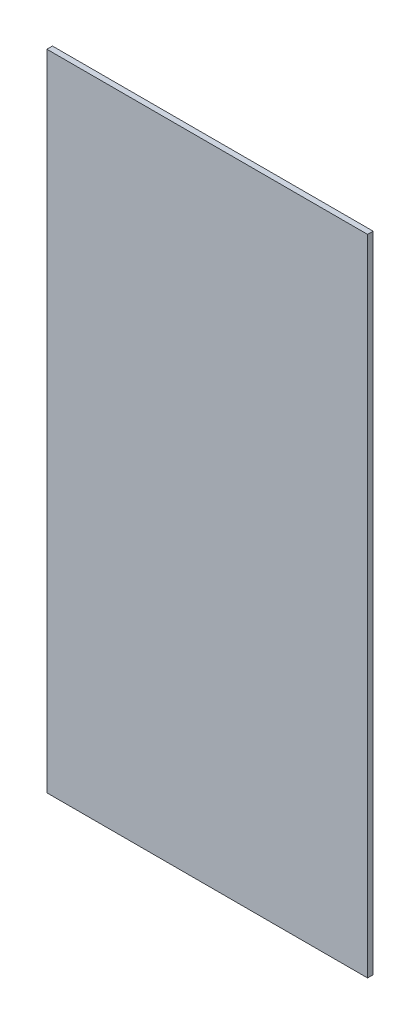
ISO-10303-21;
HEADER;
FILE_DESCRIPTION(('STEP AP214'),'2;1');
FILE_NAME('part.step','',(''),(''),'','','');
FILE_SCHEMA(('AUTOMOTIVE_DESIGN { 1 0 10303 214 1 1 1 1 }'));
ENDSEC;
DATA;
#1=APPLICATION_CONTEXT('core data for automotive mechanical design processes');
#2=APPLICATION_PROTOCOL_DEFINITION('international standard','automotive_design',2000,#1);
#3=PRODUCT_CONTEXT('',#1,'mechanical');
#4=PRODUCT('Part','Part','',(#3));
#5=PRODUCT_RELATED_PRODUCT_CATEGORY('part','',(#4));
#6=PRODUCT_DEFINITION_FORMATION('','',#4);
#7=PRODUCT_DEFINITION_CONTEXT('part definition',#1,'design');
#8=PRODUCT_DEFINITION('design','',#6,#7);
#9=PRODUCT_DEFINITION_SHAPE('','',#8);
#10=(LENGTH_UNIT() NAMED_UNIT(*) SI_UNIT(.MILLI.,.METRE.));
#11=(NAMED_UNIT(*) PLANE_ANGLE_UNIT() SI_UNIT($,.RADIAN.));
#12=(NAMED_UNIT(*) SI_UNIT($,.STERADIAN.) SOLID_ANGLE_UNIT());
#13=UNCERTAINTY_MEASURE_WITH_UNIT(LENGTH_MEASURE(1.E-05),#10,'distance_accuracy_value','');
#14=(GEOMETRIC_REPRESENTATION_CONTEXT(3) GLOBAL_UNCERTAINTY_ASSIGNED_CONTEXT((#13)) GLOBAL_UNIT_ASSIGNED_CONTEXT((#10,
#11,#12)) REPRESENTATION_CONTEXT('',''));
#15=CARTESIAN_POINT('',(0.,0.,0.));
#16=DIRECTION('',(0.,0.,1.));
#17=DIRECTION('',(1.,0.,0.));
#18=AXIS2_PLACEMENT_3D('',#15,#16,#17);
#19=CARTESIAN_POINT('',(187.5,-376.5,6.5));
#20=DIRECTION('',(-1.,0.,0.));
#21=DIRECTION('',(0.,0.,1.));
#22=AXIS2_PLACEMENT_3D('',#19,#20,#21);
#23=PLANE('',#22);
#24=DIRECTION('',(0.,1.,0.));
#25=VECTOR('',#24,1.);
#26=CARTESIAN_POINT('',(187.5,-376.5,0.));
#27=LINE('',#26,#25);
#28=CARTESIAN_POINT('',(187.5,-376.5,0.));
#29=VERTEX_POINT('',#28);
#30=CARTESIAN_POINT('',(187.5,376.5,0.));
#31=VERTEX_POINT('',#30);
#32=EDGE_CURVE('E95',#29,#31,#27,.T.);
#33=ORIENTED_EDGE('',*,*,#32,.T.);
#34=DIRECTION('',(0.,0.,-1.));
#35=VECTOR('',#34,1.);
#36=CARTESIAN_POINT('',(187.5,376.5,6.5));
#37=LINE('',#36,#35);
#38=CARTESIAN_POINT('',(187.5,376.5,6.5));
#39=VERTEX_POINT('',#38);
#40=EDGE_CURVE('E11',#39,#31,#37,.T.);
#41=ORIENTED_EDGE('',*,*,#40,.F.);
#42=DIRECTION('',(0.,1.,0.));
#43=VECTOR('',#42,1.);
#44=CARTESIAN_POINT('',(187.5,-376.5,6.5));
#45=LINE('',#44,#43);
#46=CARTESIAN_POINT('',(187.5,-376.5,6.5));
#47=VERTEX_POINT('',#46);
#48=EDGE_CURVE('E83',#47,#39,#45,.T.);
#49=ORIENTED_EDGE('',*,*,#48,.F.);
#50=DIRECTION('',(0.,0.,-1.));
#51=VECTOR('',#50,1.);
#52=CARTESIAN_POINT('',(187.5,-376.5,6.5));
#53=LINE('',#52,#51);
#54=EDGE_CURVE('E91',#47,#29,#53,.T.);
#55=ORIENTED_EDGE('',*,*,#54,.T.);
#56=EDGE_LOOP('',(#33,#41,#49,#55));
#57=FACE_BOUND('',#56,.T.);
#58=ADVANCED_FACE('F32',(#57),#23,.F.);
#59=CARTESIAN_POINT('',(-187.5,376.5,6.5));
#60=DIRECTION('',(0.,-1.,0.));
#61=DIRECTION('',(0.,0.,-1.));
#62=AXIS2_PLACEMENT_3D('',#59,#60,#61);
#63=PLANE('',#62);
#64=DIRECTION('',(-1.,0.,0.));
#65=VECTOR('',#64,1.);
#66=CARTESIAN_POINT('',(-187.5,376.5,0.));
#67=LINE('',#66,#65);
#68=CARTESIAN_POINT('',(-187.5,376.5,0.));
#69=VERTEX_POINT('',#68);
#70=EDGE_CURVE('E87',#31,#69,#67,.T.);
#71=ORIENTED_EDGE('',*,*,#70,.T.);
#72=DIRECTION('',(0.,0.,-1.));
#73=VECTOR('',#72,1.);
#74=CARTESIAN_POINT('',(-187.5,376.5,6.5));
#75=LINE('',#74,#73);
#76=CARTESIAN_POINT('',(-187.5,376.5,6.5));
#77=VERTEX_POINT('',#76);
#78=EDGE_CURVE('E40',#77,#69,#75,.T.);
#79=ORIENTED_EDGE('',*,*,#78,.F.);
#80=DIRECTION('',(-1.,0.,0.));
#81=VECTOR('',#80,1.);
#82=CARTESIAN_POINT('',(-187.5,376.5,6.5));
#83=LINE('',#82,#81);
#84=EDGE_CURVE('E78',#39,#77,#83,.T.);
#85=ORIENTED_EDGE('',*,*,#84,.F.);
#86=ORIENTED_EDGE('',*,*,#40,.T.);
#87=EDGE_LOOP('',(#71,#79,#85,#86));
#88=FACE_BOUND('',#87,.T.);
#89=ADVANCED_FACE('F86',(#88),#63,.F.);
#90=CARTESIAN_POINT('',(-187.5,-376.5,6.5));
#91=DIRECTION('',(1.,0.,0.));
#92=DIRECTION('',(0.,0.,-1.));
#93=AXIS2_PLACEMENT_3D('',#90,#91,#92);
#94=PLANE('',#93);
#95=DIRECTION('',(0.,-1.,0.));
#96=VECTOR('',#95,1.);
#97=CARTESIAN_POINT('',(-187.5,-376.5,0.));
#98=LINE('',#97,#96);
#99=CARTESIAN_POINT('',(-187.5,-376.5,0.));
#100=VERTEX_POINT('',#99);
#101=EDGE_CURVE('E65',#69,#100,#98,.T.);
#102=ORIENTED_EDGE('',*,*,#101,.T.);
#103=DIRECTION('',(0.,0.,-1.));
#104=VECTOR('',#103,1.);
#105=CARTESIAN_POINT('',(-187.5,-376.5,6.5));
#106=LINE('',#105,#104);
#107=CARTESIAN_POINT('',(-187.5,-376.5,6.5));
#108=VERTEX_POINT('',#107);
#109=EDGE_CURVE('E88',#108,#100,#106,.T.);
#110=ORIENTED_EDGE('',*,*,#109,.F.);
#111=DIRECTION('',(0.,-1.,0.));
#112=VECTOR('',#111,1.);
#113=CARTESIAN_POINT('',(-187.5,-376.5,6.5));
#114=LINE('',#113,#112);
#115=EDGE_CURVE('E81',#77,#108,#114,.T.);
#116=ORIENTED_EDGE('',*,*,#115,.F.);
#117=ORIENTED_EDGE('',*,*,#78,.T.);
#118=EDGE_LOOP('',(#102,#110,#116,#117));
#119=FACE_BOUND('',#118,.T.);
#120=ADVANCED_FACE('F89',(#119),#94,.F.);
#121=CARTESIAN_POINT('',(-187.5,-376.5,6.5));
#122=DIRECTION('',(0.,1.,0.));
#123=DIRECTION('',(0.,0.,1.));
#124=AXIS2_PLACEMENT_3D('',#121,#122,#123);
#125=PLANE('',#124);
#126=DIRECTION('',(1.,0.,0.));
#127=VECTOR('',#126,1.);
#128=CARTESIAN_POINT('',(-187.5,-376.5,0.));
#129=LINE('',#128,#127);
#130=EDGE_CURVE('E71',#100,#29,#129,.T.);
#131=ORIENTED_EDGE('',*,*,#130,.T.);
#132=ORIENTED_EDGE('',*,*,#54,.F.);
#133=DIRECTION('',(1.,0.,0.));
#134=VECTOR('',#133,1.);
#135=CARTESIAN_POINT('',(-187.5,-376.5,6.5));
#136=LINE('',#135,#134);
#137=EDGE_CURVE('E48',#108,#47,#136,.T.);
#138=ORIENTED_EDGE('',*,*,#137,.F.);
#139=ORIENTED_EDGE('',*,*,#109,.T.);
#140=EDGE_LOOP('',(#131,#132,#138,#139));
#141=FACE_BOUND('',#140,.T.);
#142=ADVANCED_FACE('F102',(#141),#125,.F.);
#143=CARTESIAN_POINT('',(0.,0.,6.5));
#144=DIRECTION('',(0.,0.,-1.));
#145=DIRECTION('',(-1.,0.,0.));
#146=AXIS2_PLACEMENT_3D('',#143,#144,#145);
#147=PLANE('',#146);
#148=ORIENTED_EDGE('',*,*,#48,.T.);
#149=ORIENTED_EDGE('',*,*,#84,.T.);
#150=ORIENTED_EDGE('',*,*,#115,.T.);
#151=ORIENTED_EDGE('',*,*,#137,.T.);
#152=EDGE_LOOP('',(#148,#149,#150,#151));
#153=FACE_BOUND('',#152,.T.);
#154=ADVANCED_FACE('F79',(#153),#147,.F.);
#155=CARTESIAN_POINT('',(0.,0.,0.));
#156=DIRECTION('',(0.,0.,-1.));
#157=DIRECTION('',(-1.,0.,0.));
#158=AXIS2_PLACEMENT_3D('',#155,#156,#157);
#159=PLANE('',#158);
#160=ORIENTED_EDGE('',*,*,#32,.F.);
#161=ORIENTED_EDGE('',*,*,#130,.F.);
#162=ORIENTED_EDGE('',*,*,#101,.F.);
#163=ORIENTED_EDGE('',*,*,#70,.F.);
#164=EDGE_LOOP('',(#160,#161,#162,#163));
#165=FACE_BOUND('',#164,.T.);
#166=ADVANCED_FACE('F105',(#165),#159,.T.);
#167=CLOSED_SHELL('',(#58,#89,#120,#142,#154,#166));
#168=MANIFOLD_SOLID_BREP('B2',#167);
#169=ADVANCED_BREP_SHAPE_REPRESENTATION('',(#18,#168),#14);
#170=SHAPE_DEFINITION_REPRESENTATION(#9,#169);
ENDSEC;
END-ISO-10303-21;
